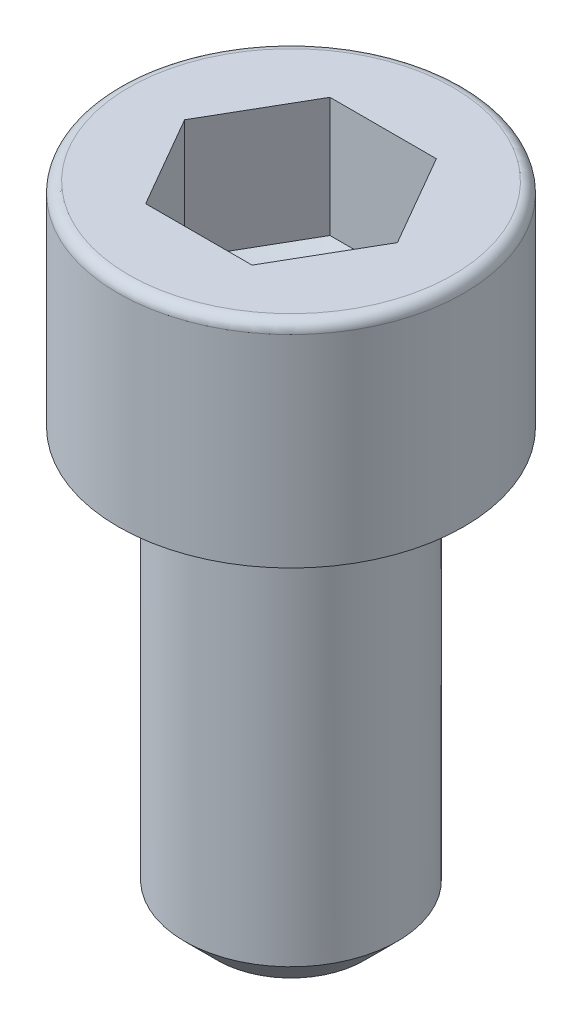
ISO-10303-21;
HEADER;
FILE_DESCRIPTION(('STEP AP214'),'2;1');
FILE_NAME('part.step','',(''),(''),'','','');
FILE_SCHEMA(('AUTOMOTIVE_DESIGN { 1 0 10303 214 1 1 1 1 }'));
ENDSEC;
DATA;
#1=APPLICATION_CONTEXT('core data for automotive mechanical design processes');
#2=APPLICATION_PROTOCOL_DEFINITION('international standard','automotive_design',2000,#1);
#3=PRODUCT_CONTEXT('',#1,'mechanical');
#4=PRODUCT('Part','Part','',(#3));
#5=PRODUCT_RELATED_PRODUCT_CATEGORY('part','',(#4));
#6=PRODUCT_DEFINITION_FORMATION('','',#4);
#7=PRODUCT_DEFINITION_CONTEXT('part definition',#1,'design');
#8=PRODUCT_DEFINITION('design','',#6,#7);
#9=PRODUCT_DEFINITION_SHAPE('','',#8);
#10=(LENGTH_UNIT() NAMED_UNIT(*) SI_UNIT(.MILLI.,.METRE.));
#11=(NAMED_UNIT(*) PLANE_ANGLE_UNIT() SI_UNIT($,.RADIAN.));
#12=(NAMED_UNIT(*) SI_UNIT($,.STERADIAN.) SOLID_ANGLE_UNIT());
#13=UNCERTAINTY_MEASURE_WITH_UNIT(LENGTH_MEASURE(1.E-05),#10,'distance_accuracy_value','');
#14=(GEOMETRIC_REPRESENTATION_CONTEXT(3) GLOBAL_UNCERTAINTY_ASSIGNED_CONTEXT((#13)) GLOBAL_UNIT_ASSIGNED_CONTEXT((#10,
#11,#12)) REPRESENTATION_CONTEXT('',''));
#15=CARTESIAN_POINT('',(0.,0.,0.));
#16=DIRECTION('',(0.,0.,1.));
#17=DIRECTION('',(1.,0.,0.));
#18=AXIS2_PLACEMENT_3D('',#15,#16,#17);
#19=CARTESIAN_POINT('',(-4.,0.,0.));
#20=DIRECTION('',(0.,1.,0.));
#21=DIRECTION('',(0.,0.,1.));
#22=AXIS2_PLACEMENT_3D('',#19,#20,#21);
#23=PLANE('',#22);
#24=CARTESIAN_POINT('',(0.,0.,0.));
#25=DIRECTION('',(0.,1.,0.));
#26=DIRECTION('',(0.,0.,1.));
#27=AXIS2_PLACEMENT_3D('',#24,#25,#26);
#28=CIRCLE('',#27,2.75);
#29=CARTESIAN_POINT('',(0.,0.,2.75));
#30=VERTEX_POINT('',#29);
#31=EDGE_CURVE('E124',#30,#30,#28,.F.);
#32=ORIENTED_EDGE('',*,*,#31,.T.);
#33=EDGE_LOOP('',(#32));
#34=FACE_BOUND('',#33,.T.);
#35=ADVANCED_FACE('F33',(#34),#23,.F.);
#36=CARTESIAN_POINT('',(0.,24.,0.));
#37=DIRECTION('',(0.,-1.,0.));
#38=DIRECTION('',(0.,0.,-1.));
#39=AXIS2_PLACEMENT_3D('',#36,#37,#38);
#40=PLANE('',#39);
#41=DIRECTION('',(0.5,0.,0.866025403784439));
#42=VECTOR('',#41,1.);
#43=CARTESIAN_POINT('',(-4.,24.,0.));
#44=LINE('',#43,#42);
#45=CARTESIAN_POINT('',(-4.,24.,0.));
#46=VERTEX_POINT('',#45);
#47=CARTESIAN_POINT('',(-2.,24.,3.46410161513775));
#48=VERTEX_POINT('',#47);
#49=EDGE_CURVE('E230',#46,#48,#44,.T.);
#50=ORIENTED_EDGE('',*,*,#49,.F.);
#51=DIRECTION('',(-0.5,0.,0.866025403784439));
#52=VECTOR('',#51,1.);
#53=CARTESIAN_POINT('',(-2.,24.,-3.46410161513776));
#54=LINE('',#53,#52);
#55=CARTESIAN_POINT('',(-2.,24.,-3.46410161513776));
#56=VERTEX_POINT('',#55);
#57=EDGE_CURVE('E48',#56,#46,#54,.T.);
#58=ORIENTED_EDGE('',*,*,#57,.F.);
#59=DIRECTION('',(-1.,0.,0.));
#60=VECTOR('',#59,1.);
#61=CARTESIAN_POINT('',(2.,24.,-3.46410161513776));
#62=LINE('',#61,#60);
#63=CARTESIAN_POINT('',(2.,24.,-3.46410161513776));
#64=VERTEX_POINT('',#63);
#65=EDGE_CURVE('E83',#64,#56,#62,.T.);
#66=ORIENTED_EDGE('',*,*,#65,.F.);
#67=DIRECTION('',(-0.5,0.,-0.866025403784439));
#68=VECTOR('',#67,1.);
#69=CARTESIAN_POINT('',(4.,24.,0.));
#70=LINE('',#69,#68);
#71=CARTESIAN_POINT('',(4.,24.,0.));
#72=VERTEX_POINT('',#71);
#73=EDGE_CURVE('E92',#72,#64,#70,.T.);
#74=ORIENTED_EDGE('',*,*,#73,.F.);
#75=DIRECTION('',(0.5,0.,-0.866025403784439));
#76=VECTOR('',#75,1.);
#77=CARTESIAN_POINT('',(2.,24.,3.46410161513776));
#78=LINE('',#77,#76);
#79=CARTESIAN_POINT('',(2.,24.,3.46410161513776));
#80=VERTEX_POINT('',#79);
#81=EDGE_CURVE('E98',#80,#72,#78,.T.);
#82=ORIENTED_EDGE('',*,*,#81,.F.);
#83=DIRECTION('',(1.,0.,0.));
#84=VECTOR('',#83,1.);
#85=CARTESIAN_POINT('',(-2.,24.,3.46410161513775));
#86=LINE('',#85,#84);
#87=EDGE_CURVE('E232',#48,#80,#86,.T.);
#88=ORIENTED_EDGE('',*,*,#87,.F.);
#89=EDGE_LOOP('',(#50,#58,#66,#74,#82,#88));
#90=FACE_BOUND('',#89,.T.);
#91=CARTESIAN_POINT('',(0.,24.,0.));
#92=DIRECTION('',(0.,-1.,0.));
#93=DIRECTION('',(0.,0.,-1.));
#94=AXIS2_PLACEMENT_3D('',#91,#92,#93);
#95=CIRCLE('',#94,6.09999999999977);
#96=CARTESIAN_POINT('',(0.,24.,-6.09999999999977));
#97=VERTEX_POINT('',#96);
#98=EDGE_CURVE('E11',#97,#97,#95,.F.);
#99=ORIENTED_EDGE('',*,*,#98,.T.);
#100=EDGE_LOOP('',(#99));
#101=FACE_BOUND('',#100,.T.);
#102=ADVANCED_FACE('F101',(#90,#101),#40,.F.);
#103=CARTESIAN_POINT('',(0.,0.,0.));
#104=DIRECTION('',(0.,-1.,0.));
#105=DIRECTION('',(0.,0.,-1.));
#106=AXIS2_PLACEMENT_3D('',#103,#104,#105);
#107=CYLINDRICAL_SURFACE('',#106,6.49999999999977);
#108=CARTESIAN_POINT('',(0.,23.6,0.));
#109=DIRECTION('',(0.,-1.,0.));
#110=DIRECTION('',(0.,0.,-1.));
#111=AXIS2_PLACEMENT_3D('',#108,#109,#110);
#112=CIRCLE('',#111,6.49999999999977);
#113=CARTESIAN_POINT('',(0.,23.6,-6.49999999999977));
#114=VERTEX_POINT('',#113);
#115=EDGE_CURVE('E41',#114,#114,#112,.T.);
#116=ORIENTED_EDGE('',*,*,#115,.T.);
#117=EDGE_LOOP('',(#116));
#118=FACE_BOUND('',#117,.T.);
#119=CARTESIAN_POINT('',(0.,16.,0.));
#120=DIRECTION('',(0.,-1.,0.));
#121=DIRECTION('',(0.,0.,-1.));
#122=AXIS2_PLACEMENT_3D('',#119,#120,#121);
#123=CIRCLE('',#122,6.49999999999977);
#124=CARTESIAN_POINT('',(0.,16.,-6.49999999999977));
#125=VERTEX_POINT('',#124);
#126=EDGE_CURVE('E121',#125,#125,#123,.T.);
#127=ORIENTED_EDGE('',*,*,#126,.F.);
#128=EDGE_LOOP('',(#127));
#129=FACE_BOUND('',#128,.T.);
#130=ADVANCED_FACE('F132',(#118,#129),#107,.T.);
#131=CARTESIAN_POINT('',(-6.49999999999977,16.,0.));
#132=DIRECTION('',(0.,1.,0.));
#133=DIRECTION('',(0.,0.,1.));
#134=AXIS2_PLACEMENT_3D('',#131,#132,#133);
#135=PLANE('',#134);
#136=CARTESIAN_POINT('',(0.,16.,0.));
#137=DIRECTION('',(0.,-1.,0.));
#138=DIRECTION('',(0.,0.,-1.));
#139=AXIS2_PLACEMENT_3D('',#136,#137,#138);
#140=CIRCLE('',#139,4.);
#141=CARTESIAN_POINT('',(0.,16.,-4.));
#142=VERTEX_POINT('',#141);
#143=EDGE_CURVE('E110',#142,#142,#140,.T.);
#144=ORIENTED_EDGE('',*,*,#143,.F.);
#145=EDGE_LOOP('',(#144));
#146=FACE_BOUND('',#145,.T.);
#147=ORIENTED_EDGE('',*,*,#126,.T.);
#148=EDGE_LOOP('',(#147));
#149=FACE_BOUND('',#148,.T.);
#150=ADVANCED_FACE('F157',(#146,#149),#135,.F.);
#151=CARTESIAN_POINT('',(0.,0.,0.));
#152=DIRECTION('',(0.,-1.,0.));
#153=DIRECTION('',(0.,0.,-1.));
#154=AXIS2_PLACEMENT_3D('',#151,#152,#153);
#155=CYLINDRICAL_SURFACE('',#154,4.);
#156=CARTESIAN_POINT('',(0.,1.25000000000001,0.));
#157=DIRECTION('',(0.,1.,0.));
#158=DIRECTION('',(0.,0.,1.));
#159=AXIS2_PLACEMENT_3D('',#156,#157,#158);
#160=CIRCLE('',#159,4.);
#161=CARTESIAN_POINT('',(0.,1.25000000000001,4.));
#162=VERTEX_POINT('',#161);
#163=EDGE_CURVE('E127',#162,#162,#160,.T.);
#164=ORIENTED_EDGE('',*,*,#163,.T.);
#165=EDGE_LOOP('',(#164));
#166=FACE_BOUND('',#165,.T.);
#167=ORIENTED_EDGE('',*,*,#143,.T.);
#168=EDGE_LOOP('',(#167));
#169=FACE_BOUND('',#168,.T.);
#170=ADVANCED_FACE('F144',(#166,#169),#155,.T.);
#171=CARTESIAN_POINT('',(0.,0.,0.));
#172=DIRECTION('',(0.,1.,0.));
#173=DIRECTION('',(0.,0.,1.));
#174=AXIS2_PLACEMENT_3D('',#171,#172,#173);
#175=CONICAL_SURFACE('',#174,2.75,0.785398163397447);
#176=CARTESIAN_POINT('',(0.,1.25000000000001,4.));
#177=CARTESIAN_POINT('',(0.,1.23697916666667,3.98697916666666));
#178=CARTESIAN_POINT('',(0.,1.22395833333334,3.97395833333333));
#179=CARTESIAN_POINT('',(0.,1.19791666666667,3.94791666666666));
#180=CARTESIAN_POINT('',(0.,1.18489583333334,3.93489583333333));
#181=CARTESIAN_POINT('',(0.,1.15885416666667,3.90885416666666));
#182=CARTESIAN_POINT('',(0.,1.14583333333334,3.89583333333333));
#183=CARTESIAN_POINT('',(0.,1.11979166666667,3.86979166666667));
#184=CARTESIAN_POINT('',(0.,1.10677083333334,3.85677083333333));
#185=CARTESIAN_POINT('',(0.,1.08072916666667,3.83072916666667));
#186=CARTESIAN_POINT('',(0.,1.06770833333334,3.81770833333333));
#187=CARTESIAN_POINT('',(0.,1.04166666666667,3.79166666666667));
#188=CARTESIAN_POINT('',(0.,1.02864583333334,3.77864583333333));
#189=CARTESIAN_POINT('',(0.,1.00260416666667,3.75260416666666));
#190=CARTESIAN_POINT('',(0.,0.989583333333338,3.73958333333333));
#191=CARTESIAN_POINT('',(0.,0.963541666666672,3.71354166666666));
#192=CARTESIAN_POINT('',(0.,0.950520833333338,3.70052083333333));
#193=CARTESIAN_POINT('',(0.,0.924479166666672,3.67447916666666));
#194=CARTESIAN_POINT('',(0.,0.911458333333338,3.66145833333333));
#195=CARTESIAN_POINT('',(0.,0.885416666666671,3.63541666666666));
#196=CARTESIAN_POINT('',(0.,0.872395833333338,3.62239583333333));
#197=CARTESIAN_POINT('',(0.,0.846354166666671,3.59635416666666));
#198=CARTESIAN_POINT('',(0.,0.833333333333338,3.58333333333333));
#199=CARTESIAN_POINT('',(0.,0.807291666666671,3.55729166666666));
#200=CARTESIAN_POINT('',(0.,0.794270833333337,3.54427083333333));
#201=CARTESIAN_POINT('',(0.,0.768229166666671,3.51822916666666));
#202=CARTESIAN_POINT('',(0.,0.755208333333337,3.50520833333333));
#203=CARTESIAN_POINT('',(0.,0.729166666666671,3.47916666666666));
#204=CARTESIAN_POINT('',(0.,0.716145833333337,3.46614583333333));
#205=CARTESIAN_POINT('',(0.,0.69010416666667,3.44010416666666));
#206=CARTESIAN_POINT('',(0.,0.677083333333337,3.42708333333333));
#207=CARTESIAN_POINT('',(0.,0.65104166666667,3.40104166666666));
#208=CARTESIAN_POINT('',(0.,0.638020833333337,3.38802083333333));
#209=CARTESIAN_POINT('',(0.,0.61197916666667,3.36197916666666));
#210=CARTESIAN_POINT('',(0.,0.598958333333336,3.34895833333333));
#211=CARTESIAN_POINT('',(0.,0.57291666666667,3.32291666666666));
#212=CARTESIAN_POINT('',(0.,0.559895833333336,3.30989583333333));
#213=CARTESIAN_POINT('',(0.,0.533854166666669,3.28385416666666));
#214=CARTESIAN_POINT('',(0.,0.520833333333336,3.27083333333333));
#215=CARTESIAN_POINT('',(0.,0.494791666666669,3.24479166666666));
#216=CARTESIAN_POINT('',(0.,0.481770833333336,3.23177083333333));
#217=CARTESIAN_POINT('',(0.,0.455729166666669,3.20572916666666));
#218=CARTESIAN_POINT('',(0.,0.442708333333336,3.19270833333333));
#219=CARTESIAN_POINT('',(0.,0.416666666666669,3.16666666666666));
#220=CARTESIAN_POINT('',(0.,0.403645833333335,3.15364583333333));
#221=CARTESIAN_POINT('',(0.,0.377604166666669,3.12760416666666));
#222=CARTESIAN_POINT('',(0.,0.364583333333335,3.11458333333333));
#223=CARTESIAN_POINT('',(0.,0.338541666666668,3.08854166666666));
#224=CARTESIAN_POINT('',(0.,0.325520833333335,3.07552083333333));
#225=CARTESIAN_POINT('',(0.,0.299479166666668,3.04947916666666));
#226=CARTESIAN_POINT('',(0.,0.286458333333335,3.03645833333333));
#227=CARTESIAN_POINT('',(0.,0.260416666666668,3.01041666666666));
#228=CARTESIAN_POINT('',(0.,0.247395833333335,2.99739583333333));
#229=CARTESIAN_POINT('',(0.,0.221354166666668,2.97135416666666));
#230=CARTESIAN_POINT('',(0.,0.208333333333334,2.95833333333333));
#231=CARTESIAN_POINT('',(0.,0.182291666666668,2.93229166666666));
#232=CARTESIAN_POINT('',(0.,0.169270833333334,2.91927083333333));
#233=CARTESIAN_POINT('',(0.,0.143229166666667,2.89322916666666));
#234=CARTESIAN_POINT('',(0.,0.130208333333334,2.88020833333333));
#235=CARTESIAN_POINT('',(0.,0.104166666666667,2.85416666666666));
#236=CARTESIAN_POINT('',(0.,0.0911458333333338,2.84114583333333));
#237=CARTESIAN_POINT('',(0.,0.0651041666666671,2.81510416666666));
#238=CARTESIAN_POINT('',(0.,0.0520833333333337,2.80208333333333));
#239=CARTESIAN_POINT('',(0.,0.0260416666666668,2.77604166666666));
#240=CARTESIAN_POINT('',(0.,0.0130208333333334,2.76302083333333));
#241=CARTESIAN_POINT('',(0.,0.,2.75));
#242=B_SPLINE_CURVE_WITH_KNOTS('',3,(#176,#177,#178,#179,#180,#181,#182,#183,#184,#185,#186,
#187,#188,#189,#190,#191,#192,#193,#194,#195,#196,#197,#198,#199,#200,#201,#202,#203,#204,#205,
#206,#207,#208,#209,#210,#211,#212,#213,#214,#215,#216,#217,#218,#219,#220,#221,#222,#223,#224,
#225,#226,#227,#228,#229,#230,#231,#232,#233,#234,#235,#236,#237,#238,#239,#240,#241),
.UNSPECIFIED.,.F.,.F.,(4,2,2,2,2,2,2,2,2,2,2,2,2,2,2,2,2,2,2,2,2,2,2,2,2,2,2,2,2,2,2,2,4),(0.,
0.0552427172801992,0.110485434560398,0.165728151840598,0.220970869120797,0.276213586400996,
0.331456303681195,0.386699020961394,0.441941738241593,0.497184455521793,0.552427172801992,
0.607669890082191,0.662912607362391,0.71815532464259,0.773398041922789,0.828640759202988,
0.883883476483188,0.939126193763387,0.994368911043586,1.04961162832379,1.10485434560398,
1.16009706288418,1.21533978016438,1.27058249744458,1.32582521472478,1.38106793200498,
1.43631064928518,1.49155336656538,1.54679608384558,1.60203880112578,1.65728151840598,
1.71252423568618,1.76776695296638),.UNSPECIFIED.);
#243=EDGE_CURVE('BSEAM137',#162,#30,#242,.T.);
#244=ORIENTED_EDGE('',*,*,#163,.F.);
#245=ORIENTED_EDGE('',*,*,#31,.F.);
#246=ORIENTED_EDGE('',*,*,#243,.T.);
#247=ORIENTED_EDGE('',*,*,#243,.F.);
#248=EDGE_LOOP('',(#244,#246,#245,#247));
#249=FACE_BOUND('',#248,.T.);
#250=ADVANCED_FACE('F137',(#249),#175,.T.);
#251=CARTESIAN_POINT('',(0.,23.6,0.));
#252=DIRECTION('',(0.,-1.,0.));
#253=DIRECTION('',(0.,0.,-1.));
#254=AXIS2_PLACEMENT_3D('',#251,#252,#253);
#255=TOROIDAL_SURFACE('',#254,6.09999999999977,0.4);
#256=ORIENTED_EDGE('',*,*,#98,.F.);
#257=EDGE_LOOP('',(#256));
#258=FACE_BOUND('',#257,.T.);
#259=ORIENTED_EDGE('',*,*,#115,.F.);
#260=EDGE_LOOP('',(#259));
#261=FACE_BOUND('',#260,.T.);
#262=ADVANCED_FACE('F35',(#258,#261),#255,.T.);
#263=CARTESIAN_POINT('',(-2.,19.5,-3.46410161513776));
#264=DIRECTION('',(-0.866025403784439,0.,-0.5));
#265=DIRECTION('',(-0.5,0.,0.866025403784439));
#266=AXIS2_PLACEMENT_3D('',#263,#264,#265);
#267=PLANE('',#266);
#268=ORIENTED_EDGE('',*,*,#57,.T.);
#269=DIRECTION('',(0.,1.,0.));
#270=VECTOR('',#269,1.);
#271=CARTESIAN_POINT('',(-4.,19.5,0.));
#272=LINE('',#271,#270);
#273=CARTESIAN_POINT('',(-4.,19.5,0.));
#274=VERTEX_POINT('',#273);
#275=EDGE_CURVE('E117',#274,#46,#272,.T.);
#276=ORIENTED_EDGE('',*,*,#275,.F.);
#277=DIRECTION('',(-0.5,0.,0.866025403784439));
#278=VECTOR('',#277,1.);
#279=CARTESIAN_POINT('',(-2.,19.5,-3.46410161513776));
#280=LINE('',#279,#278);
#281=CARTESIAN_POINT('',(-2.,19.5,-3.46410161513776));
#282=VERTEX_POINT('',#281);
#283=EDGE_CURVE('E103',#282,#274,#280,.T.);
#284=ORIENTED_EDGE('',*,*,#283,.F.);
#285=DIRECTION('',(0.,1.,0.));
#286=VECTOR('',#285,1.);
#287=CARTESIAN_POINT('',(-2.,19.5,-3.46410161513776));
#288=LINE('',#287,#286);
#289=EDGE_CURVE('E88',#282,#56,#288,.T.);
#290=ORIENTED_EDGE('',*,*,#289,.T.);
#291=EDGE_LOOP('',(#268,#276,#284,#290));
#292=FACE_BOUND('',#291,.T.);
#293=ADVANCED_FACE('F136',(#292),#267,.F.);
#294=CARTESIAN_POINT('',(2.,19.5,-3.46410161513776));
#295=DIRECTION('',(0.,0.,-1.));
#296=DIRECTION('',(-1.,0.,0.));
#297=AXIS2_PLACEMENT_3D('',#294,#295,#296);
#298=PLANE('',#297);
#299=ORIENTED_EDGE('',*,*,#65,.T.);
#300=ORIENTED_EDGE('',*,*,#289,.F.);
#301=DIRECTION('',(-1.,0.,0.));
#302=VECTOR('',#301,1.);
#303=CARTESIAN_POINT('',(2.,19.5,-3.46410161513776));
#304=LINE('',#303,#302);
#305=CARTESIAN_POINT('',(2.,19.5,-3.46410161513776));
#306=VERTEX_POINT('',#305);
#307=EDGE_CURVE('E85',#306,#282,#304,.T.);
#308=ORIENTED_EDGE('',*,*,#307,.F.);
#309=DIRECTION('',(0.,1.,0.));
#310=VECTOR('',#309,1.);
#311=CARTESIAN_POINT('',(2.,19.5,-3.46410161513776));
#312=LINE('',#311,#310);
#313=EDGE_CURVE('E78',#306,#64,#312,.T.);
#314=ORIENTED_EDGE('',*,*,#313,.T.);
#315=EDGE_LOOP('',(#299,#300,#308,#314));
#316=FACE_BOUND('',#315,.T.);
#317=ADVANCED_FACE('F80',(#316),#298,.F.);
#318=CARTESIAN_POINT('',(4.,19.5,0.));
#319=DIRECTION('',(0.866025403784439,0.,-0.5));
#320=DIRECTION('',(-0.5,0.,-0.866025403784439));
#321=AXIS2_PLACEMENT_3D('',#318,#319,#320);
#322=PLANE('',#321);
#323=ORIENTED_EDGE('',*,*,#73,.T.);
#324=ORIENTED_EDGE('',*,*,#313,.F.);
#325=DIRECTION('',(-0.5,0.,-0.866025403784439));
#326=VECTOR('',#325,1.);
#327=CARTESIAN_POINT('',(4.,19.5,0.));
#328=LINE('',#327,#326);
#329=CARTESIAN_POINT('',(4.,19.5,0.));
#330=VERTEX_POINT('',#329);
#331=EDGE_CURVE('E210',#330,#306,#328,.T.);
#332=ORIENTED_EDGE('',*,*,#331,.F.);
#333=DIRECTION('',(0.,1.,0.));
#334=VECTOR('',#333,1.);
#335=CARTESIAN_POINT('',(4.,19.5,0.));
#336=LINE('',#335,#334);
#337=EDGE_CURVE('E89',#330,#72,#336,.T.);
#338=ORIENTED_EDGE('',*,*,#337,.T.);
#339=EDGE_LOOP('',(#323,#324,#332,#338));
#340=FACE_BOUND('',#339,.T.);
#341=ADVANCED_FACE('F93',(#340),#322,.F.);
#342=CARTESIAN_POINT('',(2.,19.5,3.46410161513776));
#343=DIRECTION('',(0.866025403784439,0.,0.5));
#344=DIRECTION('',(0.5,0.,-0.866025403784439));
#345=AXIS2_PLACEMENT_3D('',#342,#343,#344);
#346=PLANE('',#345);
#347=ORIENTED_EDGE('',*,*,#81,.T.);
#348=ORIENTED_EDGE('',*,*,#337,.F.);
#349=DIRECTION('',(0.5,0.,-0.866025403784439));
#350=VECTOR('',#349,1.);
#351=CARTESIAN_POINT('',(2.,19.5,3.46410161513776));
#352=LINE('',#351,#350);
#353=CARTESIAN_POINT('',(2.,19.5,3.46410161513776));
#354=VERTEX_POINT('',#353);
#355=EDGE_CURVE('E224',#354,#330,#352,.T.);
#356=ORIENTED_EDGE('',*,*,#355,.F.);
#357=DIRECTION('',(0.,1.,0.));
#358=VECTOR('',#357,1.);
#359=CARTESIAN_POINT('',(2.,19.5,3.46410161513776));
#360=LINE('',#359,#358);
#361=EDGE_CURVE('E113',#354,#80,#360,.T.);
#362=ORIENTED_EDGE('',*,*,#361,.T.);
#363=EDGE_LOOP('',(#347,#348,#356,#362));
#364=FACE_BOUND('',#363,.T.);
#365=ADVANCED_FACE('F172',(#364),#346,.F.);
#366=CARTESIAN_POINT('',(-2.,19.5,3.46410161513775));
#367=DIRECTION('',(0.,0.,1.));
#368=DIRECTION('',(1.,0.,0.));
#369=AXIS2_PLACEMENT_3D('',#366,#367,#368);
#370=PLANE('',#369);
#371=ORIENTED_EDGE('',*,*,#87,.T.);
#372=ORIENTED_EDGE('',*,*,#361,.F.);
#373=DIRECTION('',(1.,0.,0.));
#374=VECTOR('',#373,1.);
#375=CARTESIAN_POINT('',(-2.,19.5,3.46410161513775));
#376=LINE('',#375,#374);
#377=CARTESIAN_POINT('',(-2.,19.5,3.46410161513775));
#378=VERTEX_POINT('',#377);
#379=EDGE_CURVE('E222',#378,#354,#376,.T.);
#380=ORIENTED_EDGE('',*,*,#379,.F.);
#381=DIRECTION('',(0.,1.,0.));
#382=VECTOR('',#381,1.);
#383=CARTESIAN_POINT('',(-2.,19.5,3.46410161513775));
#384=LINE('',#383,#382);
#385=EDGE_CURVE('E115',#378,#48,#384,.T.);
#386=ORIENTED_EDGE('',*,*,#385,.T.);
#387=EDGE_LOOP('',(#371,#372,#380,#386));
#388=FACE_BOUND('',#387,.T.);
#389=ADVANCED_FACE('F168',(#388),#370,.F.);
#390=CARTESIAN_POINT('',(-4.,19.5,0.));
#391=DIRECTION('',(-0.866025403784439,0.,0.5));
#392=DIRECTION('',(0.5,0.,0.866025403784439));
#393=AXIS2_PLACEMENT_3D('',#390,#391,#392);
#394=PLANE('',#393);
#395=ORIENTED_EDGE('',*,*,#49,.T.);
#396=ORIENTED_EDGE('',*,*,#385,.F.);
#397=DIRECTION('',(0.5,0.,0.866025403784439));
#398=VECTOR('',#397,1.);
#399=CARTESIAN_POINT('',(-4.,19.5,0.));
#400=LINE('',#399,#398);
#401=EDGE_CURVE('E106',#274,#378,#400,.T.);
#402=ORIENTED_EDGE('',*,*,#401,.F.);
#403=ORIENTED_EDGE('',*,*,#275,.T.);
#404=EDGE_LOOP('',(#395,#396,#402,#403));
#405=FACE_BOUND('',#404,.T.);
#406=ADVANCED_FACE('F164',(#405),#394,.F.);
#407=CARTESIAN_POINT('',(0.,19.5,0.));
#408=DIRECTION('',(0.,1.,0.));
#409=DIRECTION('',(0.,0.,1.));
#410=AXIS2_PLACEMENT_3D('',#407,#408,#409);
#411=PLANE('',#410);
#412=ORIENTED_EDGE('',*,*,#283,.T.);
#413=CARTESIAN_POINT('',(0.,19.5,0.));
#414=DIRECTION('',(0.,-1.,0.));
#415=DIRECTION('',(0.,0.,-1.));
#416=AXIS2_PLACEMENT_3D('',#413,#414,#415);
#417=CIRCLE('',#416,4.);
#418=EDGE_CURVE('E213',#274,#282,#417,.T.);
#419=ORIENTED_EDGE('',*,*,#418,.T.);
#420=EDGE_LOOP('',(#412,#419));
#421=FACE_BOUND('',#420,.T.);
#422=ADVANCED_FACE('F167',(#421),#411,.F.);
#423=ORIENTED_EDGE('',*,*,#401,.T.);
#424=EDGE_CURVE('E216',#378,#274,#417,.T.);
#425=ORIENTED_EDGE('',*,*,#424,.T.);
#426=EDGE_LOOP('',(#423,#425));
#427=FACE_BOUND('',#426,.T.);
#428=ADVANCED_FACE('F254',(#427),#411,.F.);
#429=ORIENTED_EDGE('',*,*,#379,.T.);
#430=EDGE_CURVE('E241',#354,#378,#417,.T.);
#431=ORIENTED_EDGE('',*,*,#430,.T.);
#432=EDGE_LOOP('',(#429,#431));
#433=FACE_BOUND('',#432,.T.);
#434=ADVANCED_FACE('F240',(#433),#411,.F.);
#435=ORIENTED_EDGE('',*,*,#355,.T.);
#436=EDGE_CURVE('E243',#330,#354,#417,.T.);
#437=ORIENTED_EDGE('',*,*,#436,.T.);
#438=EDGE_LOOP('',(#435,#437));
#439=FACE_BOUND('',#438,.T.);
#440=ADVANCED_FACE('F245',(#439),#411,.F.);
#441=ORIENTED_EDGE('',*,*,#331,.T.);
#442=EDGE_CURVE('E57',#306,#330,#417,.T.);
#443=ORIENTED_EDGE('',*,*,#442,.T.);
#444=EDGE_LOOP('',(#441,#443));
#445=FACE_BOUND('',#444,.T.);
#446=ADVANCED_FACE('F185',(#445),#411,.F.);
#447=ORIENTED_EDGE('',*,*,#307,.T.);
#448=EDGE_CURVE('E208',#282,#306,#417,.T.);
#449=ORIENTED_EDGE('',*,*,#448,.T.);
#450=EDGE_LOOP('',(#447,#449));
#451=FACE_BOUND('',#450,.T.);
#452=ADVANCED_FACE('F181',(#451),#411,.F.);
#453=CARTESIAN_POINT('',(0.,18.5,0.));
#454=DIRECTION('',(0.,1.,0.));
#455=DIRECTION('',(0.,0.,1.));
#456=AXIS2_PLACEMENT_3D('',#453,#454,#455);
#457=CONICAL_SURFACE('',#456,0.,1.32581766366803);
#458=ORIENTED_EDGE('',*,*,#442,.F.);
#459=ORIENTED_EDGE('',*,*,#448,.F.);
#460=ORIENTED_EDGE('',*,*,#418,.F.);
#461=ORIENTED_EDGE('',*,*,#424,.F.);
#462=ORIENTED_EDGE('',*,*,#430,.F.);
#463=ORIENTED_EDGE('',*,*,#436,.F.);
#464=EDGE_LOOP('',(#458,#459,#460,#461,#462,#463));
#465=FACE_BOUND('',#464,.T.);
#466=CARTESIAN_POINT('',(0.,18.5,0.));
#467=VERTEX_POINT('',#466);
#468=VERTEX_LOOP('',#467);
#469=FACE_BOUND('',#468,.T.);
#470=ADVANCED_FACE('F184',(#465,#469),#457,.F.);
#471=CLOSED_SHELL('',(#35,#102,#130,#150,#170,#250,#262,#293,#317,#341,#365,#389,#406,#422,#428,
#434,#440,#446,#452,#470));
#472=MANIFOLD_SOLID_BREP('B2',#471);
#473=ADVANCED_BREP_SHAPE_REPRESENTATION('',(#18,#472),#14);
#474=SHAPE_DEFINITION_REPRESENTATION(#9,#473);
ENDSEC;
END-ISO-10303-21;
